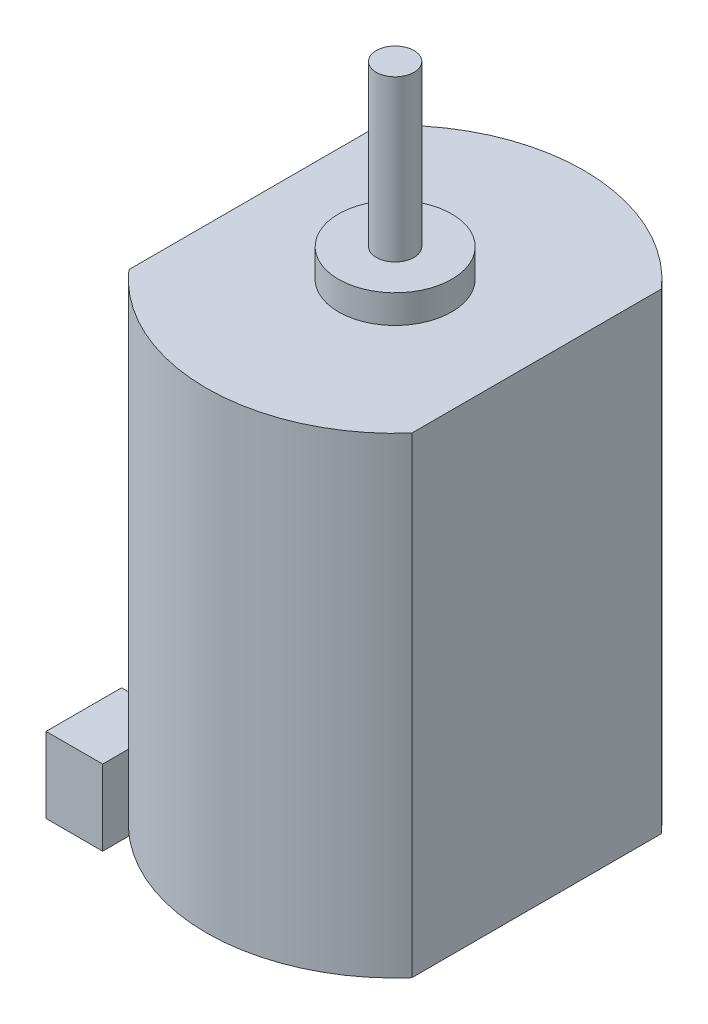
ISO-10303-21;
HEADER;
FILE_DESCRIPTION(('STEP AP214'),'2;1');
FILE_NAME('part.step','',(''),(''),'','','');
FILE_SCHEMA(('AUTOMOTIVE_DESIGN { 1 0 10303 214 1 1 1 1 }'));
ENDSEC;
DATA;
#1=APPLICATION_CONTEXT('core data for automotive mechanical design processes');
#2=APPLICATION_PROTOCOL_DEFINITION('international standard','automotive_design',2000,#1);
#3=PRODUCT_CONTEXT('',#1,'mechanical');
#4=PRODUCT('Part','Part','',(#3));
#5=PRODUCT_RELATED_PRODUCT_CATEGORY('part','',(#4));
#6=PRODUCT_DEFINITION_FORMATION('','',#4);
#7=PRODUCT_DEFINITION_CONTEXT('part definition',#1,'design');
#8=PRODUCT_DEFINITION('design','',#6,#7);
#9=PRODUCT_DEFINITION_SHAPE('','',#8);
#10=(LENGTH_UNIT() NAMED_UNIT(*) SI_UNIT(.MILLI.,.METRE.));
#11=(NAMED_UNIT(*) PLANE_ANGLE_UNIT() SI_UNIT($,.RADIAN.));
#12=(NAMED_UNIT(*) SI_UNIT($,.STERADIAN.) SOLID_ANGLE_UNIT());
#13=UNCERTAINTY_MEASURE_WITH_UNIT(LENGTH_MEASURE(1.E-05),#10,'distance_accuracy_value','');
#14=(GEOMETRIC_REPRESENTATION_CONTEXT(3) GLOBAL_UNCERTAINTY_ASSIGNED_CONTEXT((#13)) GLOBAL_UNIT_ASSIGNED_CONTEXT((#10,
#11,#12)) REPRESENTATION_CONTEXT('',''));
#15=CARTESIAN_POINT('',(0.,0.,0.));
#16=DIRECTION('',(0.,0.,1.));
#17=DIRECTION('',(1.,0.,0.));
#18=AXIS2_PLACEMENT_3D('',#15,#16,#17);
#19=CARTESIAN_POINT('',(-7.5,25.001,10.));
#20=DIRECTION('',(1.,0.,0.));
#21=DIRECTION('',(0.,0.,-1.));
#22=AXIS2_PLACEMENT_3D('',#19,#20,#21);
#23=PLANE('',#22);
#24=DIRECTION('',(0.,0.,-1.));
#25=VECTOR('',#24,1.);
#26=CARTESIAN_POINT('',(-7.5,3.,4.));
#27=LINE('',#26,#25);
#28=CARTESIAN_POINT('',(-7.5,3.,6.61437827766148));
#29=VERTEX_POINT('',#28);
#30=CARTESIAN_POINT('',(-7.5,3.,4.));
#31=VERTEX_POINT('',#30);
#32=EDGE_CURVE('E54',#29,#31,#27,.T.);
#33=ORIENTED_EDGE('',*,*,#32,.F.);
#34=DIRECTION('',(0.,-1.,0.));
#35=VECTOR('',#34,1.);
#36=CARTESIAN_POINT('',(-7.5,25.,6.61437827766148));
#37=LINE('',#36,#35);
#38=CARTESIAN_POINT('',(-7.5,25.,6.61437827766148));
#39=VERTEX_POINT('',#38);
#40=EDGE_CURVE('E237',#29,#39,#37,.F.);
#41=ORIENTED_EDGE('',*,*,#40,.T.);
#42=DIRECTION('',(0.,0.,1.));
#43=VECTOR('',#42,1.);
#44=CARTESIAN_POINT('',(-7.5,25.,10.));
#45=LINE('',#44,#43);
#46=CARTESIAN_POINT('',(-7.5,25.,-6.61437827766148));
#47=VERTEX_POINT('',#46);
#48=EDGE_CURVE('E242',#47,#39,#45,.T.);
#49=ORIENTED_EDGE('',*,*,#48,.F.);
#50=DIRECTION('',(0.,-1.,0.));
#51=VECTOR('',#50,1.);
#52=CARTESIAN_POINT('',(-7.5,25.,-6.61437827766148));
#53=LINE('',#52,#51);
#54=CARTESIAN_POINT('',(-7.5,3.,-6.61437827766148));
#55=VERTEX_POINT('',#54);
#56=EDGE_CURVE('E234',#47,#55,#53,.T.);
#57=ORIENTED_EDGE('',*,*,#56,.T.);
#58=DIRECTION('',(0.,0.,-1.));
#59=VECTOR('',#58,1.);
#60=CARTESIAN_POINT('',(-7.5,3.,-8.));
#61=LINE('',#60,#59);
#62=CARTESIAN_POINT('',(-7.5,3.,-4.));
#63=VERTEX_POINT('',#62);
#64=EDGE_CURVE('E184',#63,#55,#61,.T.);
#65=ORIENTED_EDGE('',*,*,#64,.F.);
#66=DIRECTION('',(0.,1.,0.));
#67=VECTOR('',#66,1.);
#68=CARTESIAN_POINT('',(-7.5,3.,-4.));
#69=LINE('',#68,#67);
#70=CARTESIAN_POINT('',(-7.5,0.,-4.));
#71=VERTEX_POINT('',#70);
#72=EDGE_CURVE('E11',#71,#63,#69,.T.);
#73=ORIENTED_EDGE('',*,*,#72,.F.);
#74=DIRECTION('',(0.,0.,1.));
#75=VECTOR('',#74,1.);
#76=CARTESIAN_POINT('',(-7.5,0.,10.));
#77=LINE('',#76,#75);
#78=CARTESIAN_POINT('',(-7.5,0.,4.));
#79=VERTEX_POINT('',#78);
#80=EDGE_CURVE('E250',#71,#79,#77,.T.);
#81=ORIENTED_EDGE('',*,*,#80,.T.);
#82=DIRECTION('',(0.,-1.,0.));
#83=VECTOR('',#82,1.);
#84=CARTESIAN_POINT('',(-7.5,3.,4.));
#85=LINE('',#84,#83);
#86=EDGE_CURVE('E50',#31,#79,#85,.T.);
#87=ORIENTED_EDGE('',*,*,#86,.F.);
#88=EDGE_LOOP('',(#33,#41,#49,#57,#65,#73,#81,#87));
#89=FACE_BOUND('',#88,.T.);
#90=ADVANCED_FACE('F33',(#89),#23,.F.);
#91=CARTESIAN_POINT('',(0.,25.,0.));
#92=DIRECTION('',(0.,-1.,0.));
#93=DIRECTION('',(0.,0.,-1.));
#94=AXIS2_PLACEMENT_3D('',#91,#92,#93);
#95=CYLINDRICAL_SURFACE('',#94,10.);
#96=CARTESIAN_POINT('',(0.,25.,0.));
#97=DIRECTION('',(0.,1.,0.));
#98=DIRECTION('',(0.,0.,1.));
#99=AXIS2_PLACEMENT_3D('',#96,#97,#98);
#100=CIRCLE('',#99,10.);
#101=CARTESIAN_POINT('',(7.5,25.,6.61437827766148));
#102=VERTEX_POINT('',#101);
#103=EDGE_CURVE('E259',#39,#102,#100,.T.);
#104=ORIENTED_EDGE('',*,*,#103,.F.);
#105=ORIENTED_EDGE('',*,*,#40,.F.);
#106=CARTESIAN_POINT('',(-7.5,0.,6.61437827766148));
#107=VERTEX_POINT('',#106);
#108=EDGE_CURVE('E239',#107,#29,#37,.F.);
#109=ORIENTED_EDGE('',*,*,#108,.F.);
#110=CARTESIAN_POINT('',(0.,0.,0.));
#111=DIRECTION('',(0.,1.,0.));
#112=DIRECTION('',(0.,0.,1.));
#113=AXIS2_PLACEMENT_3D('',#110,#111,#112);
#114=CIRCLE('',#113,10.);
#115=CARTESIAN_POINT('',(7.5,0.,6.61437827766148));
#116=VERTEX_POINT('',#115);
#117=EDGE_CURVE('E249',#107,#116,#114,.T.);
#118=ORIENTED_EDGE('',*,*,#117,.T.);
#119=DIRECTION('',(0.,-1.,0.));
#120=VECTOR('',#119,1.);
#121=CARTESIAN_POINT('',(7.5,25.,6.61437827766148));
#122=LINE('',#121,#120);
#123=EDGE_CURVE('E228',#102,#116,#122,.T.);
#124=ORIENTED_EDGE('',*,*,#123,.F.);
#125=EDGE_LOOP('',(#104,#105,#109,#118,#124));
#126=FACE_BOUND('',#125,.T.);
#127=ADVANCED_FACE('F300',(#126),#95,.T.);
#128=CARTESIAN_POINT('',(7.5,0.,-6.61437827766148));
#129=VERTEX_POINT('',#128);
#130=CARTESIAN_POINT('',(-7.5,0.,-6.61437827766148));
#131=VERTEX_POINT('',#130);
#132=EDGE_CURVE('E262',#129,#131,#114,.T.);
#133=ORIENTED_EDGE('',*,*,#132,.T.);
#134=EDGE_CURVE('E238',#55,#131,#53,.T.);
#135=ORIENTED_EDGE('',*,*,#134,.F.);
#136=ORIENTED_EDGE('',*,*,#56,.F.);
#137=CARTESIAN_POINT('',(7.5,25.,-6.61437827766148));
#138=VERTEX_POINT('',#137);
#139=EDGE_CURVE('E233',#138,#47,#100,.T.);
#140=ORIENTED_EDGE('',*,*,#139,.F.);
#141=DIRECTION('',(0.,-1.,0.));
#142=VECTOR('',#141,1.);
#143=CARTESIAN_POINT('',(7.5,25.,-6.61437827766148));
#144=LINE('',#143,#142);
#145=EDGE_CURVE('E252',#129,#138,#144,.F.);
#146=ORIENTED_EDGE('',*,*,#145,.F.);
#147=EDGE_LOOP('',(#133,#135,#136,#140,#146));
#148=FACE_BOUND('',#147,.T.);
#149=ADVANCED_FACE('F35',(#148),#95,.T.);
#150=CARTESIAN_POINT('',(0.,25.,0.));
#151=DIRECTION('',(0.,1.,0.));
#152=DIRECTION('',(0.,0.,1.));
#153=AXIS2_PLACEMENT_3D('',#150,#151,#152);
#154=PLANE('',#153);
#155=ORIENTED_EDGE('',*,*,#48,.T.);
#156=ORIENTED_EDGE('',*,*,#103,.T.);
#157=DIRECTION('',(0.,0.,-1.));
#158=VECTOR('',#157,1.);
#159=CARTESIAN_POINT('',(7.5,25.,10.));
#160=LINE('',#159,#158);
#161=EDGE_CURVE('E254',#102,#138,#160,.T.);
#162=ORIENTED_EDGE('',*,*,#161,.T.);
#163=ORIENTED_EDGE('',*,*,#139,.T.);
#164=EDGE_LOOP('',(#155,#156,#162,#163));
#165=FACE_BOUND('',#164,.T.);
#166=CARTESIAN_POINT('',(0.,25.,0.));
#167=DIRECTION('',(0.,1.,0.));
#168=DIRECTION('',(0.,0.,1.));
#169=AXIS2_PLACEMENT_3D('',#166,#167,#168);
#170=CIRCLE('',#169,3.);
#171=CARTESIAN_POINT('',(0.,25.,3.));
#172=VERTEX_POINT('',#171);
#173=EDGE_CURVE('E229',#172,#172,#170,.T.);
#174=ORIENTED_EDGE('',*,*,#173,.F.);
#175=EDGE_LOOP('',(#174));
#176=FACE_BOUND('',#175,.T.);
#177=ADVANCED_FACE('F291',(#165,#176),#154,.T.);
#178=CARTESIAN_POINT('',(0.,0.,0.));
#179=DIRECTION('',(0.,1.,0.));
#180=DIRECTION('',(0.,0.,1.));
#181=AXIS2_PLACEMENT_3D('',#178,#179,#180);
#182=PLANE('',#181);
#183=DIRECTION('',(0.,0.,-1.));
#184=VECTOR('',#183,1.);
#185=CARTESIAN_POINT('',(4.,0.,0.));
#186=LINE('',#185,#184);
#187=CARTESIAN_POINT('',(4.,0.,3.));
#188=VERTEX_POINT('',#187);
#189=CARTESIAN_POINT('',(4.,0.,-3.));
#190=VERTEX_POINT('',#189);
#191=EDGE_CURVE('E232',#188,#190,#186,.T.);
#192=ORIENTED_EDGE('',*,*,#191,.T.);
#193=CARTESIAN_POINT('',(0.,0.,0.));
#194=DIRECTION('',(0.,1.,0.));
#195=DIRECTION('',(0.,0.,1.));
#196=AXIS2_PLACEMENT_3D('',#193,#194,#195);
#197=CIRCLE('',#196,5.);
#198=EDGE_CURVE('E268',#190,#188,#197,.T.);
#199=ORIENTED_EDGE('',*,*,#198,.T.);
#200=EDGE_LOOP('',(#192,#199));
#201=FACE_BOUND('',#200,.T.);
#202=ORIENTED_EDGE('',*,*,#117,.F.);
#203=EDGE_CURVE('E245',#79,#107,#77,.T.);
#204=ORIENTED_EDGE('',*,*,#203,.F.);
#205=ORIENTED_EDGE('',*,*,#80,.F.);
#206=EDGE_CURVE('E246',#131,#71,#77,.T.);
#207=ORIENTED_EDGE('',*,*,#206,.F.);
#208=ORIENTED_EDGE('',*,*,#132,.F.);
#209=DIRECTION('',(0.,0.,-1.));
#210=VECTOR('',#209,1.);
#211=CARTESIAN_POINT('',(7.5,0.,10.));
#212=LINE('',#211,#210);
#213=EDGE_CURVE('E257',#116,#129,#212,.T.);
#214=ORIENTED_EDGE('',*,*,#213,.F.);
#215=EDGE_LOOP('',(#202,#204,#205,#207,#208,#214));
#216=FACE_BOUND('',#215,.T.);
#217=ADVANCED_FACE('F287',(#201,#216),#182,.F.);
#218=CARTESIAN_POINT('',(7.5,25.001,10.));
#219=DIRECTION('',(-1.,0.,0.));
#220=DIRECTION('',(0.,0.,1.));
#221=AXIS2_PLACEMENT_3D('',#218,#219,#220);
#222=PLANE('',#221);
#223=ORIENTED_EDGE('',*,*,#145,.T.);
#224=ORIENTED_EDGE('',*,*,#161,.F.);
#225=ORIENTED_EDGE('',*,*,#123,.T.);
#226=ORIENTED_EDGE('',*,*,#213,.T.);
#227=EDGE_LOOP('',(#223,#224,#225,#226));
#228=FACE_BOUND('',#227,.T.);
#229=ADVANCED_FACE('F290',(#228),#222,.F.);
#230=CARTESIAN_POINT('',(0.,26.5,0.));
#231=DIRECTION('',(0.,-1.,0.));
#232=DIRECTION('',(0.,0.,-1.));
#233=AXIS2_PLACEMENT_3D('',#230,#231,#232);
#234=CYLINDRICAL_SURFACE('',#233,3.);
#235=CARTESIAN_POINT('',(0.,26.5,0.));
#236=DIRECTION('',(0.,1.,0.));
#237=DIRECTION('',(0.,0.,1.));
#238=AXIS2_PLACEMENT_3D('',#235,#236,#237);
#239=CIRCLE('',#238,3.);
#240=CARTESIAN_POINT('',(0.,26.5,3.));
#241=VERTEX_POINT('',#240);
#242=EDGE_CURVE('E225',#241,#241,#239,.T.);
#243=ORIENTED_EDGE('',*,*,#242,.F.);
#244=EDGE_LOOP('',(#243));
#245=FACE_BOUND('',#244,.T.);
#246=ORIENTED_EDGE('',*,*,#173,.T.);
#247=EDGE_LOOP('',(#246));
#248=FACE_BOUND('',#247,.T.);
#249=ADVANCED_FACE('F338',(#245,#248),#234,.T.);
#250=CARTESIAN_POINT('',(0.,26.5,0.));
#251=DIRECTION('',(0.,1.,0.));
#252=DIRECTION('',(0.,0.,1.));
#253=AXIS2_PLACEMENT_3D('',#250,#251,#252);
#254=PLANE('',#253);
#255=CARTESIAN_POINT('',(0.,26.5,0.));
#256=DIRECTION('',(0.,1.,0.));
#257=DIRECTION('',(0.,0.,1.));
#258=AXIS2_PLACEMENT_3D('',#255,#256,#257);
#259=CIRCLE('',#258,1.);
#260=CARTESIAN_POINT('',(0.,26.5,1.));
#261=VERTEX_POINT('',#260);
#262=EDGE_CURVE('E224',#261,#261,#259,.F.);
#263=ORIENTED_EDGE('',*,*,#262,.T.);
#264=EDGE_LOOP('',(#263));
#265=FACE_BOUND('',#264,.T.);
#266=ORIENTED_EDGE('',*,*,#242,.T.);
#267=EDGE_LOOP('',(#266));
#268=FACE_BOUND('',#267,.T.);
#269=ADVANCED_FACE('F343',(#265,#268),#254,.T.);
#270=CARTESIAN_POINT('',(0.,35.,0.));
#271=DIRECTION('',(0.,-1.,0.));
#272=DIRECTION('',(0.,0.,-1.));
#273=AXIS2_PLACEMENT_3D('',#270,#271,#272);
#274=CYLINDRICAL_SURFACE('',#273,1.);
#275=ORIENTED_EDGE('',*,*,#262,.F.);
#276=EDGE_LOOP('',(#275));
#277=FACE_BOUND('',#276,.T.);
#278=CARTESIAN_POINT('',(0.,35.,0.));
#279=DIRECTION('',(0.,1.,0.));
#280=DIRECTION('',(0.,0.,1.));
#281=AXIS2_PLACEMENT_3D('',#278,#279,#280);
#282=CIRCLE('',#281,1.);
#283=CARTESIAN_POINT('',(0.,35.,1.));
#284=VERTEX_POINT('',#283);
#285=EDGE_CURVE('E219',#284,#284,#282,.T.);
#286=ORIENTED_EDGE('',*,*,#285,.F.);
#287=EDGE_LOOP('',(#286));
#288=FACE_BOUND('',#287,.T.);
#289=ADVANCED_FACE('F355',(#277,#288),#274,.T.);
#290=CARTESIAN_POINT('',(0.,35.,0.));
#291=DIRECTION('',(0.,1.,0.));
#292=DIRECTION('',(0.,0.,1.));
#293=AXIS2_PLACEMENT_3D('',#290,#291,#292);
#294=PLANE('',#293);
#295=ORIENTED_EDGE('',*,*,#285,.T.);
#296=EDGE_LOOP('',(#295));
#297=FACE_BOUND('',#296,.T.);
#298=ADVANCED_FACE('F359',(#297),#294,.T.);
#299=CARTESIAN_POINT('',(0.,-2.3,0.));
#300=DIRECTION('',(0.,1.,0.));
#301=DIRECTION('',(0.,0.,1.));
#302=AXIS2_PLACEMENT_3D('',#299,#300,#301);
#303=CYLINDRICAL_SURFACE('',#302,5.);
#304=ORIENTED_EDGE('',*,*,#198,.F.);
#305=DIRECTION('',(0.,1.,0.));
#306=VECTOR('',#305,1.);
#307=CARTESIAN_POINT('',(4.,-2.3,-3.));
#308=LINE('',#307,#306);
#309=CARTESIAN_POINT('',(4.,-2.3,-3.));
#310=VERTEX_POINT('',#309);
#311=EDGE_CURVE('E217',#310,#190,#308,.T.);
#312=ORIENTED_EDGE('',*,*,#311,.F.);
#313=CARTESIAN_POINT('',(0.,-2.3,0.));
#314=DIRECTION('',(0.,1.,0.));
#315=DIRECTION('',(0.,0.,1.));
#316=AXIS2_PLACEMENT_3D('',#313,#314,#315);
#317=CIRCLE('',#316,5.);
#318=CARTESIAN_POINT('',(4.,-2.3,3.));
#319=VERTEX_POINT('',#318);
#320=EDGE_CURVE('E210',#310,#319,#317,.T.);
#321=ORIENTED_EDGE('',*,*,#320,.T.);
#322=DIRECTION('',(0.,1.,0.));
#323=VECTOR('',#322,1.);
#324=CARTESIAN_POINT('',(4.,-2.3,3.));
#325=LINE('',#324,#323);
#326=EDGE_CURVE('E216',#319,#188,#325,.T.);
#327=ORIENTED_EDGE('',*,*,#326,.T.);
#328=EDGE_LOOP('',(#304,#312,#321,#327));
#329=FACE_BOUND('',#328,.T.);
#330=ADVANCED_FACE('F286',(#329),#303,.T.);
#331=CARTESIAN_POINT('',(4.,-2.3,0.));
#332=DIRECTION('',(1.,0.,0.));
#333=DIRECTION('',(0.,0.,-1.));
#334=AXIS2_PLACEMENT_3D('',#331,#332,#333);
#335=PLANE('',#334);
#336=ORIENTED_EDGE('',*,*,#191,.F.);
#337=ORIENTED_EDGE('',*,*,#326,.F.);
#338=DIRECTION('',(0.,0.,-1.));
#339=VECTOR('',#338,1.);
#340=CARTESIAN_POINT('',(4.,-2.3,0.));
#341=LINE('',#340,#339);
#342=EDGE_CURVE('E213',#319,#310,#341,.T.);
#343=ORIENTED_EDGE('',*,*,#342,.T.);
#344=ORIENTED_EDGE('',*,*,#311,.T.);
#345=EDGE_LOOP('',(#336,#337,#343,#344));
#346=FACE_BOUND('',#345,.T.);
#347=ADVANCED_FACE('F280',(#346),#335,.T.);
#348=CARTESIAN_POINT('',(0.,-2.3,0.));
#349=DIRECTION('',(0.,1.,0.));
#350=DIRECTION('',(0.,0.,1.));
#351=AXIS2_PLACEMENT_3D('',#348,#349,#350);
#352=PLANE('',#351);
#353=CARTESIAN_POINT('',(0.,-2.3,0.));
#354=DIRECTION('',(0.,1.,0.));
#355=DIRECTION('',(0.,0.,1.));
#356=AXIS2_PLACEMENT_3D('',#353,#354,#355);
#357=CIRCLE('',#356,1.);
#358=CARTESIAN_POINT('',(0.,-2.3,1.));
#359=VERTEX_POINT('',#358);
#360=EDGE_CURVE('E37',#359,#359,#357,.F.);
#361=ORIENTED_EDGE('',*,*,#360,.F.);
#362=EDGE_LOOP('',(#361));
#363=FACE_BOUND('',#362,.T.);
#364=ORIENTED_EDGE('',*,*,#320,.F.);
#365=ORIENTED_EDGE('',*,*,#342,.F.);
#366=EDGE_LOOP('',(#364,#365));
#367=FACE_BOUND('',#366,.T.);
#368=ADVANCED_FACE('F277',(#363,#367),#352,.F.);
#369=CARTESIAN_POINT('',(0.,-3.3,0.));
#370=DIRECTION('',(0.,1.,0.));
#371=DIRECTION('',(0.,0.,1.));
#372=AXIS2_PLACEMENT_3D('',#369,#370,#371);
#373=CYLINDRICAL_SURFACE('',#372,1.);
#374=CARTESIAN_POINT('',(0.,-3.3,0.));
#375=DIRECTION('',(0.,-1.,0.));
#376=DIRECTION('',(0.,0.,-1.));
#377=AXIS2_PLACEMENT_3D('',#374,#375,#376);
#378=CIRCLE('',#377,1.);
#379=CARTESIAN_POINT('',(0.,-3.3,-1.));
#380=VERTEX_POINT('',#379);
#381=EDGE_CURVE('E207',#380,#380,#378,.T.);
#382=ORIENTED_EDGE('',*,*,#381,.F.);
#383=EDGE_LOOP('',(#382));
#384=FACE_BOUND('',#383,.T.);
#385=ORIENTED_EDGE('',*,*,#360,.T.);
#386=EDGE_LOOP('',(#385));
#387=FACE_BOUND('',#386,.T.);
#388=ADVANCED_FACE('F275',(#384,#387),#373,.T.);
#389=CARTESIAN_POINT('',(0.,-3.3,0.));
#390=DIRECTION('',(0.,-1.,0.));
#391=DIRECTION('',(0.,0.,-1.));
#392=AXIS2_PLACEMENT_3D('',#389,#390,#391);
#393=PLANE('',#392);
#394=ORIENTED_EDGE('',*,*,#381,.T.);
#395=EDGE_LOOP('',(#394));
#396=FACE_BOUND('',#395,.T.);
#397=ADVANCED_FACE('F370',(#396),#393,.T.);
#398=CARTESIAN_POINT('',(-7.5,0.,0.));
#399=DIRECTION('',(-1.,0.,0.));
#400=DIRECTION('',(0.,0.,1.));
#401=AXIS2_PLACEMENT_3D('',#398,#399,#400);
#402=PLANE('',#401);
#403=CARTESIAN_POINT('',(-7.5,3.,-8.));
#404=VERTEX_POINT('',#403);
#405=EDGE_CURVE('E193',#55,#404,#61,.T.);
#406=ORIENTED_EDGE('',*,*,#405,.F.);
#407=ORIENTED_EDGE('',*,*,#134,.T.);
#408=ORIENTED_EDGE('',*,*,#206,.T.);
#409=CARTESIAN_POINT('',(-7.5,-1.,-4.));
#410=VERTEX_POINT('',#409);
#411=EDGE_CURVE('E43',#410,#71,#69,.T.);
#412=ORIENTED_EDGE('',*,*,#411,.F.);
#413=DIRECTION('',(0.,0.,1.));
#414=VECTOR('',#413,1.);
#415=CARTESIAN_POINT('',(-7.5,-1.,-8.));
#416=LINE('',#415,#414);
#417=CARTESIAN_POINT('',(-7.5,-1.,-8.));
#418=VERTEX_POINT('',#417);
#419=EDGE_CURVE('E174',#418,#410,#416,.T.);
#420=ORIENTED_EDGE('',*,*,#419,.F.);
#421=DIRECTION('',(0.,-1.,0.));
#422=VECTOR('',#421,1.);
#423=CARTESIAN_POINT('',(-7.5,3.,-8.));
#424=LINE('',#423,#422);
#425=EDGE_CURVE('E171',#404,#418,#424,.T.);
#426=ORIENTED_EDGE('',*,*,#425,.F.);
#427=EDGE_LOOP('',(#406,#407,#408,#412,#420,#426));
#428=FACE_BOUND('',#427,.T.);
#429=ADVANCED_FACE('F312',(#428),#402,.F.);
#430=CARTESIAN_POINT('',(-10.5,3.,-8.));
#431=DIRECTION('',(0.,0.,1.));
#432=DIRECTION('',(0.,-1.,0.));
#433=AXIS2_PLACEMENT_3D('',#430,#431,#432);
#434=PLANE('',#433);
#435=ORIENTED_EDGE('',*,*,#425,.T.);
#436=DIRECTION('',(1.,0.,0.));
#437=VECTOR('',#436,1.);
#438=CARTESIAN_POINT('',(-10.5,-1.,-8.));
#439=LINE('',#438,#437);
#440=CARTESIAN_POINT('',(-10.5,-1.,-8.));
#441=VERTEX_POINT('',#440);
#442=EDGE_CURVE('E204',#441,#418,#439,.T.);
#443=ORIENTED_EDGE('',*,*,#442,.F.);
#444=DIRECTION('',(0.,-1.,0.));
#445=VECTOR('',#444,1.);
#446=CARTESIAN_POINT('',(-10.5,3.,-8.));
#447=LINE('',#446,#445);
#448=CARTESIAN_POINT('',(-10.5,3.,-8.));
#449=VERTEX_POINT('',#448);
#450=EDGE_CURVE('E180',#449,#441,#447,.T.);
#451=ORIENTED_EDGE('',*,*,#450,.F.);
#452=DIRECTION('',(1.,0.,0.));
#453=VECTOR('',#452,1.);
#454=CARTESIAN_POINT('',(-10.5,3.,-8.));
#455=LINE('',#454,#453);
#456=EDGE_CURVE('E189',#449,#404,#455,.T.);
#457=ORIENTED_EDGE('',*,*,#456,.T.);
#458=EDGE_LOOP('',(#435,#443,#451,#457));
#459=FACE_BOUND('',#458,.T.);
#460=ADVANCED_FACE('F323',(#459),#434,.F.);
#461=CARTESIAN_POINT('',(-10.5,-1.,-8.));
#462=DIRECTION('',(0.,1.,0.));
#463=DIRECTION('',(0.,0.,1.));
#464=AXIS2_PLACEMENT_3D('',#461,#462,#463);
#465=PLANE('',#464);
#466=ORIENTED_EDGE('',*,*,#419,.T.);
#467=DIRECTION('',(1.,0.,0.));
#468=VECTOR('',#467,1.);
#469=CARTESIAN_POINT('',(-10.5,-1.,-4.));
#470=LINE('',#469,#468);
#471=CARTESIAN_POINT('',(-10.5,-1.,-4.));
#472=VERTEX_POINT('',#471);
#473=EDGE_CURVE('E201',#472,#410,#470,.T.);
#474=ORIENTED_EDGE('',*,*,#473,.F.);
#475=DIRECTION('',(0.,0.,1.));
#476=VECTOR('',#475,1.);
#477=CARTESIAN_POINT('',(-10.5,-1.,-8.));
#478=LINE('',#477,#476);
#479=EDGE_CURVE('E183',#441,#472,#478,.T.);
#480=ORIENTED_EDGE('',*,*,#479,.F.);
#481=ORIENTED_EDGE('',*,*,#442,.T.);
#482=EDGE_LOOP('',(#466,#474,#480,#481));
#483=FACE_BOUND('',#482,.T.);
#484=ADVANCED_FACE('F319',(#483),#465,.F.);
#485=CARTESIAN_POINT('',(-10.5,3.,-4.));
#486=DIRECTION('',(0.,0.,-1.));
#487=DIRECTION('',(-1.,0.,0.));
#488=AXIS2_PLACEMENT_3D('',#485,#486,#487);
#489=PLANE('',#488);
#490=ORIENTED_EDGE('',*,*,#411,.T.);
#491=ORIENTED_EDGE('',*,*,#72,.T.);
#492=DIRECTION('',(1.,0.,0.));
#493=VECTOR('',#492,1.);
#494=CARTESIAN_POINT('',(-10.5,3.,-4.));
#495=LINE('',#494,#493);
#496=CARTESIAN_POINT('',(-10.5,3.,-4.));
#497=VERTEX_POINT('',#496);
#498=EDGE_CURVE('E198',#497,#63,#495,.T.);
#499=ORIENTED_EDGE('',*,*,#498,.F.);
#500=DIRECTION('',(0.,1.,0.));
#501=VECTOR('',#500,1.);
#502=CARTESIAN_POINT('',(-10.5,3.,-4.));
#503=LINE('',#502,#501);
#504=EDGE_CURVE('E186',#472,#497,#503,.T.);
#505=ORIENTED_EDGE('',*,*,#504,.F.);
#506=ORIENTED_EDGE('',*,*,#473,.T.);
#507=EDGE_LOOP('',(#490,#491,#499,#505,#506));
#508=FACE_BOUND('',#507,.T.);
#509=ADVANCED_FACE('F314',(#508),#489,.F.);
#510=CARTESIAN_POINT('',(-10.5,3.,-8.));
#511=DIRECTION('',(0.,-1.,0.));
#512=DIRECTION('',(0.,0.,-1.));
#513=AXIS2_PLACEMENT_3D('',#510,#511,#512);
#514=PLANE('',#513);
#515=ORIENTED_EDGE('',*,*,#64,.T.);
#516=ORIENTED_EDGE('',*,*,#405,.T.);
#517=ORIENTED_EDGE('',*,*,#456,.F.);
#518=DIRECTION('',(0.,0.,-1.));
#519=VECTOR('',#518,1.);
#520=CARTESIAN_POINT('',(-10.5,3.,-8.));
#521=LINE('',#520,#519);
#522=EDGE_CURVE('E188',#497,#449,#521,.T.);
#523=ORIENTED_EDGE('',*,*,#522,.F.);
#524=ORIENTED_EDGE('',*,*,#498,.T.);
#525=EDGE_LOOP('',(#515,#516,#517,#523,#524));
#526=FACE_BOUND('',#525,.T.);
#527=ADVANCED_FACE('F328',(#526),#514,.F.);
#528=CARTESIAN_POINT('',(-10.5,0.,0.));
#529=DIRECTION('',(-1.,0.,0.));
#530=DIRECTION('',(0.,0.,1.));
#531=AXIS2_PLACEMENT_3D('',#528,#529,#530);
#532=PLANE('',#531);
#533=ORIENTED_EDGE('',*,*,#450,.T.);
#534=ORIENTED_EDGE('',*,*,#479,.T.);
#535=ORIENTED_EDGE('',*,*,#504,.T.);
#536=ORIENTED_EDGE('',*,*,#522,.T.);
#537=EDGE_LOOP('',(#533,#534,#535,#536));
#538=FACE_BOUND('',#537,.T.);
#539=ADVANCED_FACE('F383',(#538),#532,.T.);
#540=CARTESIAN_POINT('',(-7.5,0.,0.));
#541=DIRECTION('',(1.,0.,0.));
#542=DIRECTION('',(0.,0.,-1.));
#543=AXIS2_PLACEMENT_3D('',#540,#541,#542);
#544=PLANE('',#543);
#545=ORIENTED_EDGE('',*,*,#108,.T.);
#546=CARTESIAN_POINT('',(-7.5,3.,8.));
#547=VERTEX_POINT('',#546);
#548=EDGE_CURVE('E567',#547,#29,#27,.T.);
#549=ORIENTED_EDGE('',*,*,#548,.F.);
#550=DIRECTION('',(0.,1.,0.));
#551=VECTOR('',#550,1.);
#552=CARTESIAN_POINT('',(-7.5,3.,8.));
#553=LINE('',#552,#551);
#554=CARTESIAN_POINT('',(-7.5,-1.,8.));
#555=VERTEX_POINT('',#554);
#556=EDGE_CURVE('E575',#555,#547,#553,.T.);
#557=ORIENTED_EDGE('',*,*,#556,.F.);
#558=DIRECTION('',(0.,0.,1.));
#559=VECTOR('',#558,1.);
#560=CARTESIAN_POINT('',(-7.5,-1.,4.));
#561=LINE('',#560,#559);
#562=CARTESIAN_POINT('',(-7.5,-1.,4.));
#563=VERTEX_POINT('',#562);
#564=EDGE_CURVE('E170',#563,#555,#561,.T.);
#565=ORIENTED_EDGE('',*,*,#564,.F.);
#566=EDGE_CURVE('E306',#79,#563,#85,.T.);
#567=ORIENTED_EDGE('',*,*,#566,.F.);
#568=ORIENTED_EDGE('',*,*,#203,.T.);
#569=EDGE_LOOP('',(#545,#549,#557,#565,#567,#568));
#570=FACE_BOUND('',#569,.T.);
#571=ADVANCED_FACE('F305',(#570),#544,.T.);
#572=CARTESIAN_POINT('',(-10.5,-1.,4.));
#573=DIRECTION('',(0.,1.,0.));
#574=DIRECTION('',(0.,0.,1.));
#575=AXIS2_PLACEMENT_3D('',#572,#573,#574);
#576=PLANE('',#575);
#577=ORIENTED_EDGE('',*,*,#564,.T.);
#578=DIRECTION('',(1.,0.,0.));
#579=VECTOR('',#578,1.);
#580=CARTESIAN_POINT('',(-10.5,-1.,8.));
#581=LINE('',#580,#579);
#582=CARTESIAN_POINT('',(-10.5,-1.,8.));
#583=VERTEX_POINT('',#582);
#584=EDGE_CURVE('E151',#583,#555,#581,.T.);
#585=ORIENTED_EDGE('',*,*,#584,.F.);
#586=DIRECTION('',(0.,0.,1.));
#587=VECTOR('',#586,1.);
#588=CARTESIAN_POINT('',(-10.5,-1.,4.));
#589=LINE('',#588,#587);
#590=CARTESIAN_POINT('',(-10.5,-1.,4.));
#591=VERTEX_POINT('',#590);
#592=EDGE_CURVE('E158',#591,#583,#589,.T.);
#593=ORIENTED_EDGE('',*,*,#592,.F.);
#594=DIRECTION('',(1.,0.,0.));
#595=VECTOR('',#594,1.);
#596=CARTESIAN_POINT('',(-10.5,-1.,4.));
#597=LINE('',#596,#595);
#598=EDGE_CURVE('E571',#591,#563,#597,.T.);
#599=ORIENTED_EDGE('',*,*,#598,.T.);
#600=EDGE_LOOP('',(#577,#585,#593,#599));
#601=FACE_BOUND('',#600,.T.);
#602=ADVANCED_FACE('F168',(#601),#576,.F.);
#603=CARTESIAN_POINT('',(-10.5,3.,8.));
#604=DIRECTION('',(0.,0.,-1.));
#605=DIRECTION('',(0.,1.,0.));
#606=AXIS2_PLACEMENT_3D('',#603,#604,#605);
#607=PLANE('',#606);
#608=ORIENTED_EDGE('',*,*,#556,.T.);
#609=DIRECTION('',(1.,0.,0.));
#610=VECTOR('',#609,1.);
#611=CARTESIAN_POINT('',(-10.5,3.,8.));
#612=LINE('',#611,#610);
#613=CARTESIAN_POINT('',(-10.5,3.,8.));
#614=VERTEX_POINT('',#613);
#615=EDGE_CURVE('E154',#614,#547,#612,.T.);
#616=ORIENTED_EDGE('',*,*,#615,.F.);
#617=DIRECTION('',(0.,1.,0.));
#618=VECTOR('',#617,1.);
#619=CARTESIAN_POINT('',(-10.5,3.,8.));
#620=LINE('',#619,#618);
#621=EDGE_CURVE('E147',#583,#614,#620,.T.);
#622=ORIENTED_EDGE('',*,*,#621,.F.);
#623=ORIENTED_EDGE('',*,*,#584,.T.);
#624=EDGE_LOOP('',(#608,#616,#622,#623));
#625=FACE_BOUND('',#624,.T.);
#626=ADVANCED_FACE('F149',(#625),#607,.F.);
#627=CARTESIAN_POINT('',(-10.5,3.,4.));
#628=DIRECTION('',(0.,-1.,0.));
#629=DIRECTION('',(0.,0.,-1.));
#630=AXIS2_PLACEMENT_3D('',#627,#628,#629);
#631=PLANE('',#630);
#632=ORIENTED_EDGE('',*,*,#548,.T.);
#633=ORIENTED_EDGE('',*,*,#32,.T.);
#634=DIRECTION('',(1.,0.,0.));
#635=VECTOR('',#634,1.);
#636=CARTESIAN_POINT('',(-10.5,3.,4.));
#637=LINE('',#636,#635);
#638=CARTESIAN_POINT('',(-10.5,3.,4.));
#639=VERTEX_POINT('',#638);
#640=EDGE_CURVE('E176',#639,#31,#637,.T.);
#641=ORIENTED_EDGE('',*,*,#640,.F.);
#642=DIRECTION('',(0.,0.,-1.));
#643=VECTOR('',#642,1.);
#644=CARTESIAN_POINT('',(-10.5,3.,4.));
#645=LINE('',#644,#643);
#646=EDGE_CURVE('E157',#614,#639,#645,.T.);
#647=ORIENTED_EDGE('',*,*,#646,.F.);
#648=ORIENTED_EDGE('',*,*,#615,.T.);
#649=EDGE_LOOP('',(#632,#633,#641,#647,#648));
#650=FACE_BOUND('',#649,.T.);
#651=ADVANCED_FACE('F393',(#650),#631,.F.);
#652=CARTESIAN_POINT('',(-10.5,3.,4.));
#653=DIRECTION('',(0.,0.,1.));
#654=DIRECTION('',(1.,0.,0.));
#655=AXIS2_PLACEMENT_3D('',#652,#653,#654);
#656=PLANE('',#655);
#657=ORIENTED_EDGE('',*,*,#86,.T.);
#658=ORIENTED_EDGE('',*,*,#566,.T.);
#659=ORIENTED_EDGE('',*,*,#598,.F.);
#660=DIRECTION('',(0.,-1.,0.));
#661=VECTOR('',#660,1.);
#662=CARTESIAN_POINT('',(-10.5,3.,4.));
#663=LINE('',#662,#661);
#664=EDGE_CURVE('E163',#639,#591,#663,.T.);
#665=ORIENTED_EDGE('',*,*,#664,.F.);
#666=ORIENTED_EDGE('',*,*,#640,.T.);
#667=EDGE_LOOP('',(#657,#658,#659,#665,#666));
#668=FACE_BOUND('',#667,.T.);
#669=ADVANCED_FACE('F396',(#668),#656,.F.);
#670=CARTESIAN_POINT('',(-10.5,0.,0.));
#671=DIRECTION('',(1.,0.,0.));
#672=DIRECTION('',(0.,0.,-1.));
#673=AXIS2_PLACEMENT_3D('',#670,#671,#672);
#674=PLANE('',#673);
#675=ORIENTED_EDGE('',*,*,#592,.T.);
#676=ORIENTED_EDGE('',*,*,#621,.T.);
#677=ORIENTED_EDGE('',*,*,#646,.T.);
#678=ORIENTED_EDGE('',*,*,#664,.T.);
#679=EDGE_LOOP('',(#675,#676,#677,#678));
#680=FACE_BOUND('',#679,.T.);
#681=ADVANCED_FACE('F161',(#680),#674,.F.);
#682=CLOSED_SHELL('',(#90,#127,#149,#177,#217,#229,#249,#269,#289,#298,#330,#347,#368,#388,#397,
#429,#460,#484,#509,#527,#539,#571,#602,#626,#651,#669,#681));
#683=MANIFOLD_SOLID_BREP('B2',#682);
#684=ADVANCED_BREP_SHAPE_REPRESENTATION('',(#18,#683),#14);
#685=SHAPE_DEFINITION_REPRESENTATION(#9,#684);
ENDSEC;
END-ISO-10303-21;
